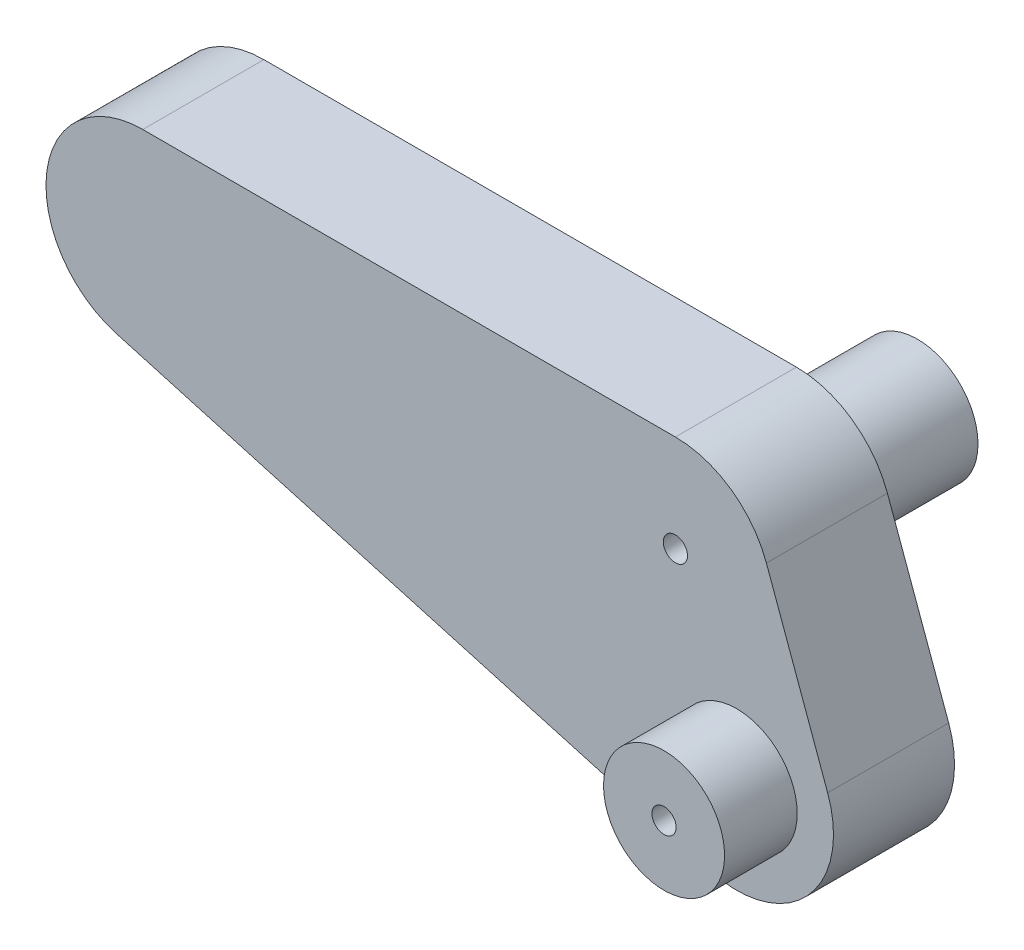
ISO-10303-21;
HEADER;
FILE_DESCRIPTION(('STEP AP214'),'2;1');
FILE_NAME('part.step','',(''),(''),'','','');
FILE_SCHEMA(('AUTOMOTIVE_DESIGN { 1 0 10303 214 1 1 1 1 }'));
ENDSEC;
DATA;
#1=APPLICATION_CONTEXT('core data for automotive mechanical design processes');
#2=APPLICATION_PROTOCOL_DEFINITION('international standard','automotive_design',2000,#1);
#3=PRODUCT_CONTEXT('',#1,'mechanical');
#4=PRODUCT('Part','Part','',(#3));
#5=PRODUCT_RELATED_PRODUCT_CATEGORY('part','',(#4));
#6=PRODUCT_DEFINITION_FORMATION('','',#4);
#7=PRODUCT_DEFINITION_CONTEXT('part definition',#1,'design');
#8=PRODUCT_DEFINITION('design','',#6,#7);
#9=PRODUCT_DEFINITION_SHAPE('','',#8);
#10=(LENGTH_UNIT() NAMED_UNIT(*) SI_UNIT(.MILLI.,.METRE.));
#11=(NAMED_UNIT(*) PLANE_ANGLE_UNIT() SI_UNIT($,.RADIAN.));
#12=(NAMED_UNIT(*) SI_UNIT($,.STERADIAN.) SOLID_ANGLE_UNIT());
#13=UNCERTAINTY_MEASURE_WITH_UNIT(LENGTH_MEASURE(1.E-05),#10,'distance_accuracy_value','');
#14=(GEOMETRIC_REPRESENTATION_CONTEXT(3) GLOBAL_UNCERTAINTY_ASSIGNED_CONTEXT((#13)) GLOBAL_UNIT_ASSIGNED_CONTEXT((#10,
#11,#12)) REPRESENTATION_CONTEXT('',''));
#15=CARTESIAN_POINT('',(0.,0.,0.));
#16=DIRECTION('',(0.,0.,1.));
#17=DIRECTION('',(1.,0.,0.));
#18=AXIS2_PLACEMENT_3D('',#15,#16,#17);
#19=CARTESIAN_POINT('',(0.,0.,5.));
#20=DIRECTION('',(0.,0.,1.));
#21=DIRECTION('',(1.,0.,0.));
#22=AXIS2_PLACEMENT_3D('',#19,#20,#21);
#23=PLANE('',#22);
#24=CARTESIAN_POINT('',(0.,0.,5.));
#25=DIRECTION('',(0.,0.,1.));
#26=DIRECTION('',(1.,0.,0.));
#27=AXIS2_PLACEMENT_3D('',#24,#25,#26);
#28=CIRCLE('',#27,4.);
#29=CARTESIAN_POINT('',(3.75877048314363,1.36808057330269,5.));
#30=VERTEX_POINT('',#29);
#31=CARTESIAN_POINT('',(0.,4.,5.));
#32=VERTEX_POINT('',#31);
#33=EDGE_CURVE('E130',#30,#32,#28,.T.);
#34=ORIENTED_EDGE('',*,*,#33,.T.);
#35=DIRECTION('',(-1.,0.,0.));
#36=VECTOR('',#35,1.);
#37=CARTESIAN_POINT('',(-22.,4.,5.));
#38=LINE('',#37,#36);
#39=CARTESIAN_POINT('',(-22.,4.,5.));
#40=VERTEX_POINT('',#39);
#41=EDGE_CURVE('E88',#32,#40,#38,.T.);
#42=ORIENTED_EDGE('',*,*,#41,.T.);
#43=CARTESIAN_POINT('',(-22.,0.,5.));
#44=DIRECTION('',(0.,0.,1.));
#45=DIRECTION('',(1.,0.,0.));
#46=AXIS2_PLACEMENT_3D('',#43,#44,#45);
#47=CIRCLE('',#46,4.);
#48=CARTESIAN_POINT('',(-23.0908880308897,-3.84837151325877,5.));
#49=VERTEX_POINT('',#48);
#50=EDGE_CURVE('E101',#40,#49,#47,.T.);
#51=ORIENTED_EDGE('',*,*,#50,.T.);
#52=DIRECTION('',(0.962092878314692,-0.272722007722426,0.));
#53=VECTOR('',#52,1.);
#54=CARTESIAN_POINT('',(1.44006102972027,-10.8020969070745,5.));
#55=LINE('',#54,#53);
#56=CARTESIAN_POINT('',(1.44006102972027,-10.8020969070745,5.));
#57=VERTEX_POINT('',#56);
#58=EDGE_CURVE('E95',#49,#57,#55,.T.);
#59=ORIENTED_EDGE('',*,*,#58,.T.);
#60=CARTESIAN_POINT('',(2.53094906060998,-6.95372539381571,5.));
#61=DIRECTION('',(0.,0.,1.));
#62=DIRECTION('',(1.,0.,0.));
#63=AXIS2_PLACEMENT_3D('',#60,#61,#62);
#64=CIRCLE('',#63,4.);
#65=CARTESIAN_POINT('',(6.28971954375361,-5.58564482051302,5.));
#66=VERTEX_POINT('',#65);
#67=EDGE_CURVE('E99',#57,#66,#64,.T.);
#68=ORIENTED_EDGE('',*,*,#67,.T.);
#69=DIRECTION('',(-0.342020143325673,0.939692620785907,0.));
#70=VECTOR('',#69,1.);
#71=CARTESIAN_POINT('',(3.75877048314363,1.36808057330269,5.));
#72=LINE('',#71,#70);
#73=EDGE_CURVE('E51',#66,#30,#72,.T.);
#74=ORIENTED_EDGE('',*,*,#73,.T.);
#75=EDGE_LOOP('',(#34,#42,#51,#59,#68,#74));
#76=FACE_BOUND('',#75,.T.);
#77=CARTESIAN_POINT('',(2.53094906060998,-6.95372539381571,5.));
#78=DIRECTION('',(0.,0.,1.));
#79=DIRECTION('',(1.,0.,0.));
#80=AXIS2_PLACEMENT_3D('',#77,#78,#79);
#81=CIRCLE('',#80,2.5);
#82=CARTESIAN_POINT('',(5.03094906060998,-6.95372539381571,5.));
#83=VERTEX_POINT('',#82);
#84=EDGE_CURVE('E123',#83,#83,#81,.T.);
#85=ORIENTED_EDGE('',*,*,#84,.F.);
#86=EDGE_LOOP('',(#85));
#87=FACE_BOUND('',#86,.T.);
#88=CARTESIAN_POINT('',(0.,0.,5.));
#89=DIRECTION('',(0.,0.,1.));
#90=DIRECTION('',(1.,0.,0.));
#91=AXIS2_PLACEMENT_3D('',#88,#89,#90);
#92=CIRCLE('',#91,0.5);
#93=CARTESIAN_POINT('',(0.5,0.,5.));
#94=VERTEX_POINT('',#93);
#95=EDGE_CURVE('E197',#94,#94,#92,.T.);
#96=ORIENTED_EDGE('',*,*,#95,.F.);
#97=EDGE_LOOP('',(#96));
#98=FACE_BOUND('',#97,.T.);
#99=ADVANCED_FACE('F34',(#76,#87,#98),#23,.T.);
#100=CARTESIAN_POINT('',(0.,0.,0.));
#101=DIRECTION('',(0.,0.,1.));
#102=DIRECTION('',(1.,0.,0.));
#103=AXIS2_PLACEMENT_3D('',#100,#101,#102);
#104=PLANE('',#103);
#105=CARTESIAN_POINT('',(0.,0.,0.));
#106=DIRECTION('',(0.,0.,1.));
#107=DIRECTION('',(1.,0.,0.));
#108=AXIS2_PLACEMENT_3D('',#105,#106,#107);
#109=CIRCLE('',#108,4.);
#110=CARTESIAN_POINT('',(3.75877048314363,1.36808057330269,0.));
#111=VERTEX_POINT('',#110);
#112=CARTESIAN_POINT('',(0.,4.,0.));
#113=VERTEX_POINT('',#112);
#114=EDGE_CURVE('E119',#111,#113,#109,.T.);
#115=ORIENTED_EDGE('',*,*,#114,.F.);
#116=DIRECTION('',(-0.342020143325673,0.939692620785907,0.));
#117=VECTOR('',#116,1.);
#118=CARTESIAN_POINT('',(3.75877048314363,1.36808057330269,0.));
#119=LINE('',#118,#117);
#120=CARTESIAN_POINT('',(6.28971954375361,-5.58564482051302,0.));
#121=VERTEX_POINT('',#120);
#122=EDGE_CURVE('E80',#121,#111,#119,.T.);
#123=ORIENTED_EDGE('',*,*,#122,.F.);
#124=CARTESIAN_POINT('',(2.53094906060998,-6.95372539381571,0.));
#125=DIRECTION('',(0.,0.,1.));
#126=DIRECTION('',(1.,0.,0.));
#127=AXIS2_PLACEMENT_3D('',#124,#125,#126);
#128=CIRCLE('',#127,4.);
#129=CARTESIAN_POINT('',(1.44006102972027,-10.8020969070745,0.));
#130=VERTEX_POINT('',#129);
#131=EDGE_CURVE('E74',#130,#121,#128,.T.);
#132=ORIENTED_EDGE('',*,*,#131,.F.);
#133=DIRECTION('',(0.962092878314692,-0.272722007722426,0.));
#134=VECTOR('',#133,1.);
#135=CARTESIAN_POINT('',(1.44006102972027,-10.8020969070745,0.));
#136=LINE('',#135,#134);
#137=CARTESIAN_POINT('',(-23.0908880308897,-3.84837151325877,0.));
#138=VERTEX_POINT('',#137);
#139=EDGE_CURVE('E109',#138,#130,#136,.T.);
#140=ORIENTED_EDGE('',*,*,#139,.F.);
#141=CARTESIAN_POINT('',(-22.,0.,0.));
#142=DIRECTION('',(0.,0.,1.));
#143=DIRECTION('',(1.,0.,0.));
#144=AXIS2_PLACEMENT_3D('',#141,#142,#143);
#145=CIRCLE('',#144,4.);
#146=CARTESIAN_POINT('',(-22.,4.,0.));
#147=VERTEX_POINT('',#146);
#148=EDGE_CURVE('E125',#147,#138,#145,.T.);
#149=ORIENTED_EDGE('',*,*,#148,.F.);
#150=DIRECTION('',(-1.,0.,0.));
#151=VECTOR('',#150,1.);
#152=CARTESIAN_POINT('',(-22.,4.,0.));
#153=LINE('',#152,#151);
#154=EDGE_CURVE('E122',#113,#147,#153,.T.);
#155=ORIENTED_EDGE('',*,*,#154,.F.);
#156=EDGE_LOOP('',(#115,#123,#132,#140,#149,#155));
#157=FACE_BOUND('',#156,.T.);
#158=CARTESIAN_POINT('',(0.,0.,0.));
#159=DIRECTION('',(0.,0.,1.));
#160=DIRECTION('',(1.,0.,0.));
#161=AXIS2_PLACEMENT_3D('',#158,#159,#160);
#162=CIRCLE('',#161,2.5);
#163=CARTESIAN_POINT('',(2.5,0.,0.));
#164=VERTEX_POINT('',#163);
#165=EDGE_CURVE('E206',#164,#164,#162,.T.);
#166=ORIENTED_EDGE('',*,*,#165,.T.);
#167=EDGE_LOOP('',(#166));
#168=FACE_BOUND('',#167,.T.);
#169=CARTESIAN_POINT('',(2.53094906060998,-6.95372539381571,0.));
#170=DIRECTION('',(0.,0.,-1.));
#171=DIRECTION('',(-1.,0.,0.));
#172=AXIS2_PLACEMENT_3D('',#169,#170,#171);
#173=CIRCLE('',#172,0.5);
#174=CARTESIAN_POINT('',(2.03094906060998,-6.95372539381571,0.));
#175=VERTEX_POINT('',#174);
#176=EDGE_CURVE('E189',#175,#175,#173,.T.);
#177=ORIENTED_EDGE('',*,*,#176,.F.);
#178=EDGE_LOOP('',(#177));
#179=FACE_BOUND('',#178,.T.);
#180=ADVANCED_FACE('F139',(#157,#168,#179),#104,.F.);
#181=CARTESIAN_POINT('',(0.,0.,5.));
#182=DIRECTION('',(0.,0.,-1.));
#183=DIRECTION('',(-1.,0.,0.));
#184=AXIS2_PLACEMENT_3D('',#181,#182,#183);
#185=CYLINDRICAL_SURFACE('',#184,4.);
#186=ORIENTED_EDGE('',*,*,#114,.T.);
#187=DIRECTION('',(0.,0.,-1.));
#188=VECTOR('',#187,1.);
#189=CARTESIAN_POINT('',(0.,4.,5.));
#190=LINE('',#189,#188);
#191=EDGE_CURVE('E11',#32,#113,#190,.T.);
#192=ORIENTED_EDGE('',*,*,#191,.F.);
#193=ORIENTED_EDGE('',*,*,#33,.F.);
#194=DIRECTION('',(0.,0.,-1.));
#195=VECTOR('',#194,1.);
#196=CARTESIAN_POINT('',(3.75877048314363,1.36808057330269,5.));
#197=LINE('',#196,#195);
#198=EDGE_CURVE('E115',#30,#111,#197,.T.);
#199=ORIENTED_EDGE('',*,*,#198,.T.);
#200=EDGE_LOOP('',(#186,#192,#193,#199));
#201=FACE_BOUND('',#200,.T.);
#202=ADVANCED_FACE('F36',(#201),#185,.T.);
#203=CARTESIAN_POINT('',(-22.,4.,5.));
#204=DIRECTION('',(0.,-1.,0.));
#205=DIRECTION('',(1.,0.,0.));
#206=AXIS2_PLACEMENT_3D('',#203,#204,#205);
#207=PLANE('',#206);
#208=ORIENTED_EDGE('',*,*,#154,.T.);
#209=DIRECTION('',(0.,0.,-1.));
#210=VECTOR('',#209,1.);
#211=CARTESIAN_POINT('',(-22.,4.,5.));
#212=LINE('',#211,#210);
#213=EDGE_CURVE('E43',#40,#147,#212,.T.);
#214=ORIENTED_EDGE('',*,*,#213,.F.);
#215=ORIENTED_EDGE('',*,*,#41,.F.);
#216=ORIENTED_EDGE('',*,*,#191,.T.);
#217=EDGE_LOOP('',(#208,#214,#215,#216));
#218=FACE_BOUND('',#217,.T.);
#219=ADVANCED_FACE('F272',(#218),#207,.F.);
#220=CARTESIAN_POINT('',(-22.,0.,5.));
#221=DIRECTION('',(0.,0.,-1.));
#222=DIRECTION('',(-1.,0.,0.));
#223=AXIS2_PLACEMENT_3D('',#220,#221,#222);
#224=CYLINDRICAL_SURFACE('',#223,4.);
#225=ORIENTED_EDGE('',*,*,#148,.T.);
#226=DIRECTION('',(0.,0.,-1.));
#227=VECTOR('',#226,1.);
#228=CARTESIAN_POINT('',(-23.0908880308897,-3.84837151325877,5.));
#229=LINE('',#228,#227);
#230=EDGE_CURVE('E110',#49,#138,#229,.T.);
#231=ORIENTED_EDGE('',*,*,#230,.F.);
#232=ORIENTED_EDGE('',*,*,#50,.F.);
#233=ORIENTED_EDGE('',*,*,#213,.T.);
#234=EDGE_LOOP('',(#225,#231,#232,#233));
#235=FACE_BOUND('',#234,.T.);
#236=ADVANCED_FACE('F136',(#235),#224,.T.);
#237=CARTESIAN_POINT('',(1.44006102972027,-10.8020969070745,5.));
#238=DIRECTION('',(0.272722007722426,0.962092878314692,0.));
#239=DIRECTION('',(-0.962092878314692,0.272722007722426,0.));
#240=AXIS2_PLACEMENT_3D('',#237,#238,#239);
#241=PLANE('',#240);
#242=ORIENTED_EDGE('',*,*,#139,.T.);
#243=DIRECTION('',(0.,0.,-1.));
#244=VECTOR('',#243,1.);
#245=CARTESIAN_POINT('',(1.44006102972027,-10.8020969070745,5.));
#246=LINE('',#245,#244);
#247=EDGE_CURVE('E106',#57,#130,#246,.T.);
#248=ORIENTED_EDGE('',*,*,#247,.F.);
#249=ORIENTED_EDGE('',*,*,#58,.F.);
#250=ORIENTED_EDGE('',*,*,#230,.T.);
#251=EDGE_LOOP('',(#242,#248,#249,#250));
#252=FACE_BOUND('',#251,.T.);
#253=ADVANCED_FACE('F107',(#252),#241,.F.);
#254=CARTESIAN_POINT('',(2.53094906060998,-6.95372539381571,5.));
#255=DIRECTION('',(0.,0.,-1.));
#256=DIRECTION('',(-1.,0.,0.));
#257=AXIS2_PLACEMENT_3D('',#254,#255,#256);
#258=CYLINDRICAL_SURFACE('',#257,4.);
#259=ORIENTED_EDGE('',*,*,#131,.T.);
#260=DIRECTION('',(0.,0.,-1.));
#261=VECTOR('',#260,1.);
#262=CARTESIAN_POINT('',(6.28971954375361,-5.58564482051302,5.));
#263=LINE('',#262,#261);
#264=EDGE_CURVE('E111',#66,#121,#263,.T.);
#265=ORIENTED_EDGE('',*,*,#264,.F.);
#266=ORIENTED_EDGE('',*,*,#67,.F.);
#267=ORIENTED_EDGE('',*,*,#247,.T.);
#268=EDGE_LOOP('',(#259,#265,#266,#267));
#269=FACE_BOUND('',#268,.T.);
#270=ADVANCED_FACE('F113',(#269),#258,.T.);
#271=CARTESIAN_POINT('',(3.75877048314363,1.36808057330269,5.));
#272=DIRECTION('',(-0.939692620785907,-0.342020143325673,0.));
#273=DIRECTION('',(0.342020143325673,-0.939692620785907,0.));
#274=AXIS2_PLACEMENT_3D('',#271,#272,#273);
#275=PLANE('',#274);
#276=ORIENTED_EDGE('',*,*,#122,.T.);
#277=ORIENTED_EDGE('',*,*,#198,.F.);
#278=ORIENTED_EDGE('',*,*,#73,.F.);
#279=ORIENTED_EDGE('',*,*,#264,.T.);
#280=EDGE_LOOP('',(#276,#277,#278,#279));
#281=FACE_BOUND('',#280,.T.);
#282=ADVANCED_FACE('F144',(#281),#275,.F.);
#283=CARTESIAN_POINT('',(0.,0.,-5.));
#284=DIRECTION('',(0.,0.,1.));
#285=DIRECTION('',(1.,0.,0.));
#286=AXIS2_PLACEMENT_3D('',#283,#284,#285);
#287=CYLINDRICAL_SURFACE('',#286,2.5);
#288=CARTESIAN_POINT('',(0.,0.,-5.));
#289=DIRECTION('',(0.,0.,1.));
#290=DIRECTION('',(1.,0.,0.));
#291=AXIS2_PLACEMENT_3D('',#288,#289,#290);
#292=CIRCLE('',#291,2.5);
#293=CARTESIAN_POINT('',(2.5,0.,-5.));
#294=VERTEX_POINT('',#293);
#295=EDGE_CURVE('E201',#294,#294,#292,.T.);
#296=ORIENTED_EDGE('',*,*,#295,.T.);
#297=EDGE_LOOP('',(#296));
#298=FACE_BOUND('',#297,.T.);
#299=ORIENTED_EDGE('',*,*,#165,.F.);
#300=EDGE_LOOP('',(#299));
#301=FACE_BOUND('',#300,.T.);
#302=ADVANCED_FACE('F146',(#298,#301),#287,.T.);
#303=CARTESIAN_POINT('',(0.,0.,-5.));
#304=DIRECTION('',(0.,0.,1.));
#305=DIRECTION('',(1.,0.,0.));
#306=AXIS2_PLACEMENT_3D('',#303,#304,#305);
#307=PLANE('',#306);
#308=CARTESIAN_POINT('',(0.,0.,-5.));
#309=DIRECTION('',(0.,0.,1.));
#310=DIRECTION('',(1.,0.,0.));
#311=AXIS2_PLACEMENT_3D('',#308,#309,#310);
#312=CIRCLE('',#311,0.5);
#313=CARTESIAN_POINT('',(0.5,0.,-5.));
#314=VERTEX_POINT('',#313);
#315=EDGE_CURVE('E198',#314,#314,#312,.T.);
#316=ORIENTED_EDGE('',*,*,#315,.T.);
#317=EDGE_LOOP('',(#316));
#318=FACE_BOUND('',#317,.T.);
#319=ORIENTED_EDGE('',*,*,#295,.F.);
#320=EDGE_LOOP('',(#319));
#321=FACE_BOUND('',#320,.T.);
#322=ADVANCED_FACE('F152',(#318,#321),#307,.F.);
#323=CARTESIAN_POINT('',(0.,0.,-5.));
#324=DIRECTION('',(0.,0.,1.));
#325=DIRECTION('',(1.,0.,0.));
#326=AXIS2_PLACEMENT_3D('',#323,#324,#325);
#327=CYLINDRICAL_SURFACE('',#326,0.5);
#328=ORIENTED_EDGE('',*,*,#315,.F.);
#329=EDGE_LOOP('',(#328));
#330=FACE_BOUND('',#329,.T.);
#331=ORIENTED_EDGE('',*,*,#95,.T.);
#332=EDGE_LOOP('',(#331));
#333=FACE_BOUND('',#332,.T.);
#334=ADVANCED_FACE('F165',(#330,#333),#327,.F.);
#335=CARTESIAN_POINT('',(2.53094906060998,-6.95372539381571,8.));
#336=DIRECTION('',(0.,0.,-1.));
#337=DIRECTION('',(-1.,0.,0.));
#338=AXIS2_PLACEMENT_3D('',#335,#336,#337);
#339=CYLINDRICAL_SURFACE('',#338,2.5);
#340=ORIENTED_EDGE('',*,*,#84,.T.);
#341=EDGE_LOOP('',(#340));
#342=FACE_BOUND('',#341,.T.);
#343=CARTESIAN_POINT('',(2.53094906060998,-6.95372539381571,8.));
#344=DIRECTION('',(0.,0.,-1.));
#345=DIRECTION('',(-1.,0.,0.));
#346=AXIS2_PLACEMENT_3D('',#343,#344,#345);
#347=CIRCLE('',#346,2.5);
#348=CARTESIAN_POINT('',(0.0309490606099781,-6.95372539381571,8.));
#349=VERTEX_POINT('',#348);
#350=EDGE_CURVE('E192',#349,#349,#347,.T.);
#351=ORIENTED_EDGE('',*,*,#350,.T.);
#352=EDGE_LOOP('',(#351));
#353=FACE_BOUND('',#352,.T.);
#354=ADVANCED_FACE('F169',(#342,#353),#339,.T.);
#355=CARTESIAN_POINT('',(2.53094906060998,-6.95372539381571,8.));
#356=DIRECTION('',(0.,0.,-1.));
#357=DIRECTION('',(-1.,0.,0.));
#358=AXIS2_PLACEMENT_3D('',#355,#356,#357);
#359=PLANE('',#358);
#360=CARTESIAN_POINT('',(2.53094906060998,-6.95372539381571,8.));
#361=DIRECTION('',(0.,0.,-1.));
#362=DIRECTION('',(-1.,0.,0.));
#363=AXIS2_PLACEMENT_3D('',#360,#361,#362);
#364=CIRCLE('',#363,0.5);
#365=CARTESIAN_POINT('',(2.03094906060998,-6.95372539381571,8.));
#366=VERTEX_POINT('',#365);
#367=EDGE_CURVE('E186',#366,#366,#364,.T.);
#368=ORIENTED_EDGE('',*,*,#367,.T.);
#369=EDGE_LOOP('',(#368));
#370=FACE_BOUND('',#369,.T.);
#371=ORIENTED_EDGE('',*,*,#350,.F.);
#372=EDGE_LOOP('',(#371));
#373=FACE_BOUND('',#372,.T.);
#374=ADVANCED_FACE('F173',(#370,#373),#359,.F.);
#375=CARTESIAN_POINT('',(2.53094906060998,-6.95372539381571,8.));
#376=DIRECTION('',(0.,0.,-1.));
#377=DIRECTION('',(-1.,0.,0.));
#378=AXIS2_PLACEMENT_3D('',#375,#376,#377);
#379=CYLINDRICAL_SURFACE('',#378,0.5);
#380=ORIENTED_EDGE('',*,*,#367,.F.);
#381=EDGE_LOOP('',(#380));
#382=FACE_BOUND('',#381,.T.);
#383=ORIENTED_EDGE('',*,*,#176,.T.);
#384=EDGE_LOOP('',(#383));
#385=FACE_BOUND('',#384,.T.);
#386=ADVANCED_FACE('F177',(#382,#385),#379,.F.);
#387=CLOSED_SHELL('',(#99,#180,#202,#219,#236,#253,#270,#282,#302,#322,#334,#354,#374,#386));
#388=MANIFOLD_SOLID_BREP('B2',#387);
#389=ADVANCED_BREP_SHAPE_REPRESENTATION('',(#18,#388),#14);
#390=SHAPE_DEFINITION_REPRESENTATION(#9,#389);
ENDSEC;
END-ISO-10303-21;
